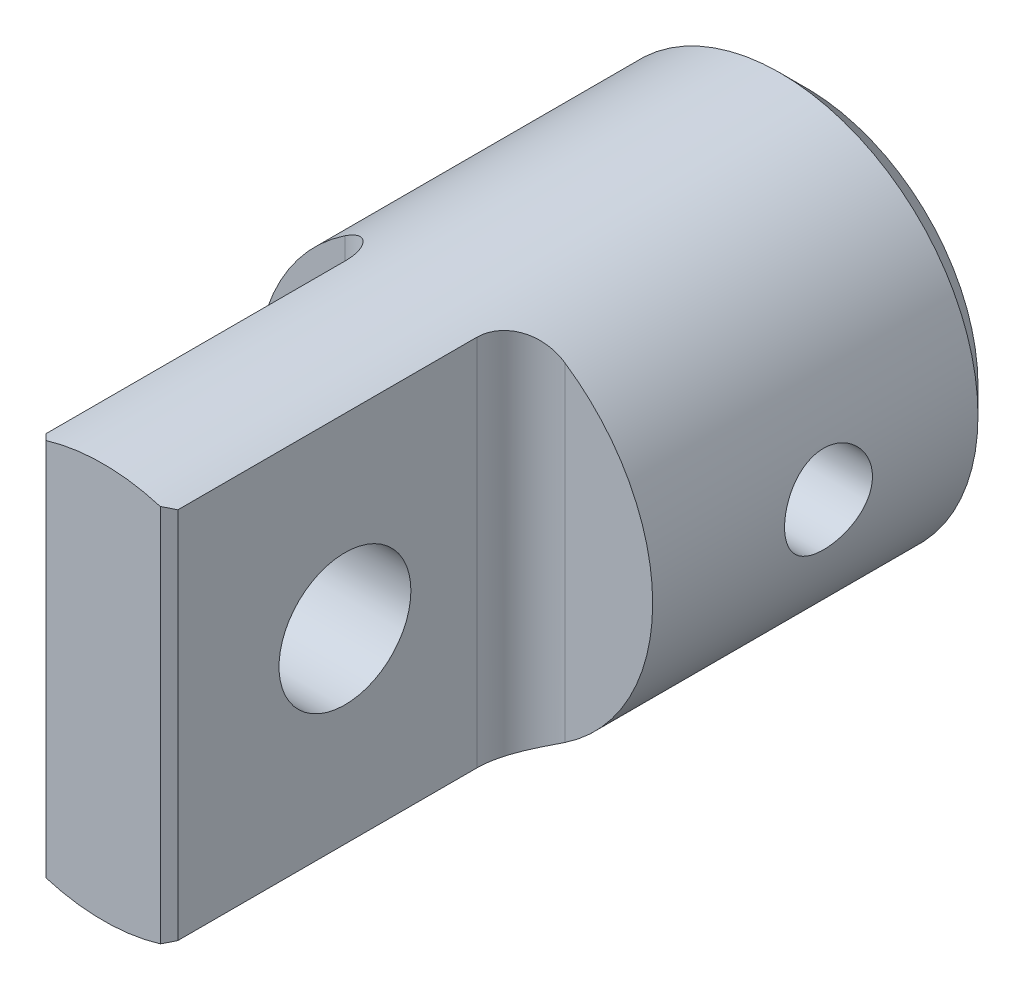
ISO-10303-21;
HEADER;
FILE_DESCRIPTION(('STEP AP214'),'2;1');
FILE_NAME('part.step','',(''),(''),'','','');
FILE_SCHEMA(('AUTOMOTIVE_DESIGN { 1 0 10303 214 1 1 1 1 }'));
ENDSEC;
DATA;
#1=APPLICATION_CONTEXT('core data for automotive mechanical design processes');
#2=APPLICATION_PROTOCOL_DEFINITION('international standard','automotive_design',2000,#1);
#3=PRODUCT_CONTEXT('',#1,'mechanical');
#4=PRODUCT('Part','Part','',(#3));
#5=PRODUCT_RELATED_PRODUCT_CATEGORY('part','',(#4));
#6=PRODUCT_DEFINITION_FORMATION('','',#4);
#7=PRODUCT_DEFINITION_CONTEXT('part definition',#1,'design');
#8=PRODUCT_DEFINITION('design','',#6,#7);
#9=PRODUCT_DEFINITION_SHAPE('','',#8);
#10=(LENGTH_UNIT() NAMED_UNIT(*) SI_UNIT(.MILLI.,.METRE.));
#11=(NAMED_UNIT(*) PLANE_ANGLE_UNIT() SI_UNIT($,.RADIAN.));
#12=(NAMED_UNIT(*) SI_UNIT($,.STERADIAN.) SOLID_ANGLE_UNIT());
#13=UNCERTAINTY_MEASURE_WITH_UNIT(LENGTH_MEASURE(1.E-05),#10,'distance_accuracy_value','');
#14=(GEOMETRIC_REPRESENTATION_CONTEXT(3) GLOBAL_UNCERTAINTY_ASSIGNED_CONTEXT((#13)) GLOBAL_UNIT_ASSIGNED_CONTEXT((#10,
#11,#12)) REPRESENTATION_CONTEXT('',''));
#15=CARTESIAN_POINT('',(0.,0.,0.));
#16=DIRECTION('',(0.,0.,1.));
#17=DIRECTION('',(1.,0.,0.));
#18=AXIS2_PLACEMENT_3D('',#15,#16,#17);
#19=CARTESIAN_POINT('',(0.,0.,80.));
#20=DIRECTION('',(0.,0.,-1.));
#21=DIRECTION('',(-1.,0.,0.));
#22=AXIS2_PLACEMENT_3D('',#19,#20,#21);
#23=CYLINDRICAL_SURFACE('',#22,22.5);
#24=CARTESIAN_POINT('',(-22.5,0.,15.));
#25=CARTESIAN_POINT('',(-22.4999949054563,0.277201191939118,15.0000093091996));
#26=CARTESIAN_POINT('',(-22.4948253498923,0.554513913174048,15.0231299541587));
#27=CARTESIAN_POINT('',(-22.4747024439418,1.10125486025783,15.1149011808764));
#28=CARTESIAN_POINT('',(-22.4597422554339,1.37067743784747,15.1835835850232));
#29=CARTESIAN_POINT('',(-22.421702829225,1.89365819440382,15.3642149262291));
#30=CARTESIAN_POINT('',(-22.3986322109764,2.14723288025071,15.4761179424947));
#31=CARTESIAN_POINT('',(-22.3468583860351,2.6320004507844,15.739866531181));
#32=CARTESIAN_POINT('',(-22.3181552886865,2.86319376983337,15.8917113282266));
#33=CARTESIAN_POINT('',(-22.2577273543527,3.30046578503508,16.2336891627666));
#34=CARTESIAN_POINT('',(-22.2259640410261,3.5061215301088,16.4243562553376));
#35=CARTESIAN_POINT('',(-22.1632650270043,3.88281227614595,16.8374201502331));
#36=CARTESIAN_POINT('',(-22.132329402237,4.05384411027149,17.059819851777));
#37=CARTESIAN_POINT('',(-22.0744082065066,4.35831108525865,17.5331796101448));
#38=CARTESIAN_POINT('',(-22.0474718934386,4.49129355260966,17.7844373951004));
#39=CARTESIAN_POINT('',(-22.0011524089458,4.71298247386312,18.3064319042344));
#40=CARTESIAN_POINT('',(-21.9817683031266,4.80169440550397,18.5771662137733));
#41=CARTESIAN_POINT('',(-21.9531402359799,4.93092145016118,19.1258336933053));
#42=CARTESIAN_POINT('',(-21.9437386433446,4.97218667594937,19.4035817877401));
#43=CARTESIAN_POINT('',(-21.9356668414217,5.00768177493915,19.9622055444361));
#44=CARTESIAN_POINT('',(-21.9369952689832,5.00191762279195,20.2430808048922));
#45=CARTESIAN_POINT('',(-21.9500908041844,4.94412068793336,20.794391567986));
#46=CARTESIAN_POINT('',(-21.9616607847499,4.89296161150564,21.0649240603488));
#47=CARTESIAN_POINT('',(-21.993623854663,4.74721226702843,21.5934678583121));
#48=CARTESIAN_POINT('',(-22.0140174532947,4.65261949204123,21.8514784402134));
#49=CARTESIAN_POINT('',(-22.0615227492924,4.42189182182192,22.3500985959548));
#50=CARTESIAN_POINT('',(-22.0886881090716,4.28542298448383,22.5905483183402));
#51=CARTESIAN_POINT('',(-22.1466434477592,3.97505170349622,23.0454571762897));
#52=CARTESIAN_POINT('',(-22.1774339355124,3.80114400185685,23.2599126545504));
#53=CARTESIAN_POINT('',(-22.2400143653192,3.41621709257457,23.6617732733712));
#54=CARTESIAN_POINT('',(-22.2718112671975,3.20445551316558,23.8484669627626));
#55=CARTESIAN_POINT('',(-22.3321959780572,2.75226654522904,24.1838093222678));
#56=CARTESIAN_POINT('',(-22.3607837252105,2.51183860459342,24.3324572594547));
#57=CARTESIAN_POINT('',(-22.4116266058404,2.00825797683683,24.587673189442));
#58=CARTESIAN_POINT('',(-22.4338673251915,1.74505530579963,24.6941456107706));
#59=CARTESIAN_POINT('',(-22.4694034091563,1.20388982745364,24.8611525326447));
#60=CARTESIAN_POINT('',(-22.4827001174196,0.925929243983408,24.9216939335353));
#61=CARTESIAN_POINT('',(-22.4986579440418,0.369238708202107,24.9940800331379));
#62=CARTESIAN_POINT('',(-22.5015312155572,0.0906409932972585,25.0068962504042));
#63=CARTESIAN_POINT('',(-22.496913966265,-0.464714809820204,24.9861047393491));
#64=CARTESIAN_POINT('',(-22.4894241722617,-0.74147302567662,24.9525002667014));
#65=CARTESIAN_POINT('',(-22.4650564689652,-1.28205814332355,24.8406264620798));
#66=CARTESIAN_POINT('',(-22.4482861751934,-1.5459962292887,24.7628688594414));
#67=CARTESIAN_POINT('',(-22.4072355271705,-2.05708201463959,24.5654657813873));
#68=CARTESIAN_POINT('',(-22.3829545191188,-2.30422825002548,24.4458166592349));
#69=CARTESIAN_POINT('',(-22.3290538306887,-2.77871609973592,24.1660178080026));
#70=CARTESIAN_POINT('',(-22.2993611147475,-3.00571432708049,24.005300142485));
#71=CARTESIAN_POINT('',(-22.2380758087357,-3.42986741247043,23.648671877246));
#72=CARTESIAN_POINT('',(-22.2064829637869,-3.6270182543358,23.4527565491682));
#73=CARTESIAN_POINT('',(-22.1442219736121,-3.98973870477415,23.0268299160498));
#74=CARTESIAN_POINT('',(-22.1135829414823,-4.1546345485,22.7962397749894));
#75=CARTESIAN_POINT('',(-22.0573848845825,-4.44336529807064,22.3100699139671));
#76=CARTESIAN_POINT('',(-22.0318256378478,-4.56720199818121,22.0544912866227));
#77=CARTESIAN_POINT('',(-21.9889300132591,-4.76945004740288,21.5269792772506));
#78=CARTESIAN_POINT('',(-21.9715469897688,-4.84811965884861,21.255148894392));
#79=CARTESIAN_POINT('',(-21.9468912408989,-4.95855069144011,20.7016895379162));
#80=CARTESIAN_POINT('',(-21.9396168385988,-4.99031989295584,20.4200621974652));
#81=CARTESIAN_POINT('',(-21.936110036307,-5.00570891602905,19.8618028042766));
#82=CARTESIAN_POINT('',(-21.9396324581123,-4.99039782859127,19.5852012298064));
#83=CARTESIAN_POINT('',(-21.956766622574,-4.91445692803306,19.0386257250505));
#84=CARTESIAN_POINT('',(-21.9703782383105,-4.85382768500485,18.7686517114357));
#85=CARTESIAN_POINT('',(-22.0060357036517,-4.68949549952189,18.243877199444));
#86=CARTESIAN_POINT('',(-22.0280501296667,-4.58595291571222,17.9890242077993));
#87=CARTESIAN_POINT('',(-22.078044111629,-4.33886925870767,17.5001500186298));
#88=CARTESIAN_POINT('',(-22.1060243118894,-4.1953238646296,17.2661310750891));
#89=CARTESIAN_POINT('',(-22.1655260709102,-3.86878397476419,16.820308477631));
#90=CARTESIAN_POINT('',(-22.1971092842007,-3.68502963777602,16.6090694876936));
#91=CARTESIAN_POINT('',(-22.2598493543275,-3.28482176486253,16.2200748151714));
#92=CARTESIAN_POINT('',(-22.2910061107244,-3.06836066558357,16.0423268987289));
#93=CARTESIAN_POINT('',(-22.3498814931665,-2.60536492661394,15.7230600427003));
#94=CARTESIAN_POINT('',(-22.3775480874812,-2.35846409158738,15.5820620006627));
#95=CARTESIAN_POINT('',(-22.4258014592307,-1.84390069944704,15.343791739547));
#96=CARTESIAN_POINT('',(-22.4463940817703,-1.57625550828249,15.2464833998846));
#97=CARTESIAN_POINT('',(-22.474570322739,-1.09034561932353,15.115396624308));
#98=CARTESIAN_POINT('',(-22.4840467255803,-0.874679979754207,15.0722065658343));
#99=CARTESIAN_POINT('',(-22.4967634364947,-0.439366124736322,15.0145052392346));
#100=CARTESIAN_POINT('',(-22.5000040380903,-0.219718097232198,14.9999926212452));
#101=CARTESIAN_POINT('',(-22.5,0.,15.));
#102=B_SPLINE_CURVE_WITH_KNOTS('',3,(#24,#25,#26,#27,#28,#29,#30,#31,#32,#33,#34,#35,#36,#37,
#38,#39,#40,#41,#42,#43,#44,#45,#46,#47,#48,#49,#50,#51,#52,#53,#54,#55,#56,#57,#58,#59,#60,#61,
#62,#63,#64,#65,#66,#67,#68,#69,#70,#71,#72,#73,#74,#75,#76,#77,#78,#79,#80,#81,#82,#83,#84,#85,
#86,#87,#88,#89,#90,#91,#92,#93,#94,#95,#96,#97,#98,#99,#100,#101),.UNSPECIFIED.,.T.,.F.,(4,2,2,
2,2,2,2,2,2,2,2,2,2,2,2,2,2,2,2,2,2,2,2,2,2,2,2,2,2,2,2,2,2,2,2,2,2,2,4),(0.,0.830799224324492,
1.66217932812321,2.49267853101864,3.32316161292473,4.16595180005197,5.00881903726285,
5.86133240744939,6.7137402671935,7.55247814098694,8.39110946248412,9.21394170371394,
10.0368214437428,10.8664417428089,11.6961786315268,12.5444544952938,13.392746699315,
14.2429503203503,15.093026187619,15.9256998031761,16.758315022876,17.5814717356985,
18.4047001237058,19.2399950816204,20.0754023347633,20.9267368277125,21.7780341128296,
22.6244139764775,23.4706534172859,24.2978196287089,25.1249754347416,25.9490678005646,
26.7732492148298,27.6146081579908,28.4561619618304,29.3090646764094,30.1612609469435,
30.8198086841341,31.4783254223689),.UNSPECIFIED.);
#103=CARTESIAN_POINT('',(-22.5,0.,15.));
#104=VERTEX_POINT('',#103);
#105=EDGE_CURVE('E11',#104,#104,#102,.T.);
#106=ORIENTED_EDGE('',*,*,#105,.T.);
#107=EDGE_LOOP('',(#106));
#108=FACE_BOUND('',#107,.T.);
#109=CARTESIAN_POINT('',(22.5,0.,15.));
#110=CARTESIAN_POINT('',(22.4999949054563,-0.277201191939121,15.0000093091996));
#111=CARTESIAN_POINT('',(22.4948253498922,-0.554513913174051,15.0231299541587));
#112=CARTESIAN_POINT('',(22.4747024439418,-1.10125486025784,15.1149011808764));
#113=CARTESIAN_POINT('',(22.4597422554339,-1.37067743784747,15.1835835850232));
#114=CARTESIAN_POINT('',(22.421702829225,-1.89365819440382,15.3642149262291));
#115=CARTESIAN_POINT('',(22.3986322109764,-2.14723288025071,15.4761179424947));
#116=CARTESIAN_POINT('',(22.3468583860351,-2.63200045078441,15.739866531181));
#117=CARTESIAN_POINT('',(22.3181552886865,-2.86319376983337,15.8917113282266));
#118=CARTESIAN_POINT('',(22.2577273543527,-3.30046578503508,16.2336891627666));
#119=CARTESIAN_POINT('',(22.2259640410261,-3.50612153010881,16.4243562553376));
#120=CARTESIAN_POINT('',(22.1632650270043,-3.88281227614596,16.8374201502331));
#121=CARTESIAN_POINT('',(22.132329402237,-4.05384411027149,17.059819851777));
#122=CARTESIAN_POINT('',(22.0744082065066,-4.35831108525865,17.5331796101448));
#123=CARTESIAN_POINT('',(22.0474718934386,-4.49129355260967,17.7844373951004));
#124=CARTESIAN_POINT('',(22.0011524089458,-4.71298247386313,18.3064319042345));
#125=CARTESIAN_POINT('',(21.9817683031266,-4.80169440550397,18.5771662137733));
#126=CARTESIAN_POINT('',(21.9531402359799,-4.93092145016118,19.1258336933053));
#127=CARTESIAN_POINT('',(21.9437386433446,-4.97218667594937,19.4035817877401));
#128=CARTESIAN_POINT('',(21.9356668414217,-5.00768177493916,19.9622055444361));
#129=CARTESIAN_POINT('',(21.9369952689832,-5.00191762279196,20.2430808048922));
#130=CARTESIAN_POINT('',(21.9500908041844,-4.94412068793337,20.794391567986));
#131=CARTESIAN_POINT('',(21.9616607847499,-4.89296161150565,21.0649240603488));
#132=CARTESIAN_POINT('',(21.993623854663,-4.74721226702843,21.5934678583121));
#133=CARTESIAN_POINT('',(22.0140174532947,-4.65261949204123,21.8514784402134));
#134=CARTESIAN_POINT('',(22.0615227492924,-4.42189182182193,22.3500985959548));
#135=CARTESIAN_POINT('',(22.0886881090716,-4.28542298448384,22.5905483183402));
#136=CARTESIAN_POINT('',(22.1466434477592,-3.97505170349623,23.0454571762897));
#137=CARTESIAN_POINT('',(22.1774339355124,-3.80114400185685,23.2599126545504));
#138=CARTESIAN_POINT('',(22.2400143653192,-3.41621709257458,23.6617732733712));
#139=CARTESIAN_POINT('',(22.2718112671975,-3.20445551316559,23.8484669627626));
#140=CARTESIAN_POINT('',(22.3321959780572,-2.75226654522905,24.1838093222678));
#141=CARTESIAN_POINT('',(22.3607837252105,-2.51183860459343,24.3324572594547));
#142=CARTESIAN_POINT('',(22.4116266058404,-2.00825797683684,24.587673189442));
#143=CARTESIAN_POINT('',(22.4338673251915,-1.74505530579964,24.6941456107706));
#144=CARTESIAN_POINT('',(22.4694034091563,-1.20388982745364,24.8611525326447));
#145=CARTESIAN_POINT('',(22.4827001174196,-0.925929243983415,24.9216939335353));
#146=CARTESIAN_POINT('',(22.4986579440418,-0.369238708202114,24.9940800331379));
#147=CARTESIAN_POINT('',(22.5015312155572,-0.0906409932972653,25.0068962504042));
#148=CARTESIAN_POINT('',(22.496913966265,0.464714809820198,24.9861047393491));
#149=CARTESIAN_POINT('',(22.4894241722617,0.741473025676614,24.9525002667014));
#150=CARTESIAN_POINT('',(22.4650564689652,1.28205814332355,24.8406264620798));
#151=CARTESIAN_POINT('',(22.4482861751934,1.5459962292887,24.7628688594414));
#152=CARTESIAN_POINT('',(22.4072355271705,2.05708201463959,24.5654657813873));
#153=CARTESIAN_POINT('',(22.3829545191188,2.30422825002548,24.4458166592349));
#154=CARTESIAN_POINT('',(22.3290538306887,2.77871609973591,24.1660178080026));
#155=CARTESIAN_POINT('',(22.2993611147475,3.00571432708048,24.005300142485));
#156=CARTESIAN_POINT('',(22.2380758087357,3.42986741247042,23.648671877246));
#157=CARTESIAN_POINT('',(22.2064829637869,3.62701825433579,23.4527565491682));
#158=CARTESIAN_POINT('',(22.1442219736121,3.98973870477415,23.0268299160498));
#159=CARTESIAN_POINT('',(22.1135829414823,4.15463454849999,22.7962397749894));
#160=CARTESIAN_POINT('',(22.0573848845825,4.44336529807064,22.3100699139671));
#161=CARTESIAN_POINT('',(22.0318256378478,4.5672019981812,22.0544912866227));
#162=CARTESIAN_POINT('',(21.9889300132591,4.76945004740287,21.5269792772506));
#163=CARTESIAN_POINT('',(21.9715469897688,4.8481196588486,21.255148894392));
#164=CARTESIAN_POINT('',(21.9468912408989,4.9585506914401,20.7016895379162));
#165=CARTESIAN_POINT('',(21.9396168385988,4.99031989295583,20.4200621974652));
#166=CARTESIAN_POINT('',(21.936110036307,5.00570891602905,19.8618028042766));
#167=CARTESIAN_POINT('',(21.9396324581123,4.99039782859127,19.5852012298064));
#168=CARTESIAN_POINT('',(21.956766622574,4.91445692803305,19.0386257250505));
#169=CARTESIAN_POINT('',(21.9703782383105,4.85382768500485,18.7686517114357));
#170=CARTESIAN_POINT('',(22.0060357036517,4.68949549952189,18.243877199444));
#171=CARTESIAN_POINT('',(22.0280501296667,4.58595291571221,17.9890242077993));
#172=CARTESIAN_POINT('',(22.078044111629,4.33886925870767,17.5001500186298));
#173=CARTESIAN_POINT('',(22.1060243118894,4.1953238646296,17.2661310750891));
#174=CARTESIAN_POINT('',(22.1655260709102,3.86878397476419,16.820308477631));
#175=CARTESIAN_POINT('',(22.1971092842007,3.68502963777602,16.6090694876936));
#176=CARTESIAN_POINT('',(22.2598493543275,3.28482176486253,16.2200748151714));
#177=CARTESIAN_POINT('',(22.2910061107244,3.06836066558357,16.0423268987289));
#178=CARTESIAN_POINT('',(22.3498814931665,2.60536492661393,15.7230600427003));
#179=CARTESIAN_POINT('',(22.3775480874812,2.35846409158737,15.5820620006627));
#180=CARTESIAN_POINT('',(22.4258014592307,1.84390069944704,15.343791739547));
#181=CARTESIAN_POINT('',(22.4463940817703,1.57625550828248,15.2464833998846));
#182=CARTESIAN_POINT('',(22.474570322739,1.09034561932352,15.115396624308));
#183=CARTESIAN_POINT('',(22.4840467255803,0.874679979754204,15.0722065658343));
#184=CARTESIAN_POINT('',(22.4967634364947,0.439366124736319,15.0145052392346));
#185=CARTESIAN_POINT('',(22.5000040380903,0.219718097232195,14.9999926212452));
#186=CARTESIAN_POINT('',(22.5,0.,15.));
#187=B_SPLINE_CURVE_WITH_KNOTS('',3,(#109,#110,#111,#112,#113,#114,#115,#116,#117,#118,#119,
#120,#121,#122,#123,#124,#125,#126,#127,#128,#129,#130,#131,#132,#133,#134,#135,#136,#137,#138,
#139,#140,#141,#142,#143,#144,#145,#146,#147,#148,#149,#150,#151,#152,#153,#154,#155,#156,#157,
#158,#159,#160,#161,#162,#163,#164,#165,#166,#167,#168,#169,#170,#171,#172,#173,#174,#175,#176,
#177,#178,#179,#180,#181,#182,#183,#184,#185,#186),.UNSPECIFIED.,.T.,.F.,(4,2,2,2,2,2,2,2,2,2,2,
2,2,2,2,2,2,2,2,2,2,2,2,2,2,2,2,2,2,2,2,2,2,2,2,2,2,2,4),(0.,0.830799224324492,1.66217932812321,
2.49267853101865,3.32316161292473,4.16595180005198,5.00881903726285,5.8613324074494,
6.7137402671935,7.55247814098695,8.39110946248412,9.21394170371394,10.0368214437428,
10.8664417428089,11.6961786315269,12.5444544952938,13.392746699315,14.2429503203503,
15.093026187619,15.9256998031761,16.758315022876,17.5814717356985,18.4047001237058,
19.2399950816204,20.0754023347633,20.9267368277126,21.7780341128296,22.6244139764775,
23.4706534172859,24.2978196287089,25.1249754347416,25.9490678005646,26.7732492148298,
27.6146081579908,28.4561619618304,29.3090646764094,30.1612609469435,30.8198086841341,
31.4783254223689),.UNSPECIFIED.);
#188=CARTESIAN_POINT('',(22.5,0.,15.));
#189=VERTEX_POINT('',#188);
#190=EDGE_CURVE('E47',#189,#189,#187,.T.);
#191=ORIENTED_EDGE('',*,*,#190,.T.);
#192=EDGE_LOOP('',(#191));
#193=FACE_BOUND('',#192,.T.);
#194=CARTESIAN_POINT('',(0.,0.,3.00000000000002));
#195=DIRECTION('',(0.,0.,1.));
#196=DIRECTION('',(1.,0.,0.));
#197=AXIS2_PLACEMENT_3D('',#194,#195,#196);
#198=CIRCLE('',#197,22.5);
#199=CARTESIAN_POINT('',(22.5,0.,3.00000000000002));
#200=VERTEX_POINT('',#199);
#201=EDGE_CURVE('E201',#200,#200,#198,.T.);
#202=ORIENTED_EDGE('',*,*,#201,.T.);
#203=EDGE_LOOP('',(#202));
#204=FACE_BOUND('',#203,.T.);
#205=DIRECTION('',(0.,0.,1.));
#206=VECTOR('',#205,1.);
#207=CARTESIAN_POINT('',(-7.49999999999999,21.2132034355964,40.));
#208=LINE('',#207,#206);
#209=CARTESIAN_POINT('',(-7.49999999999999,21.2132034355964,45.));
#210=VERTEX_POINT('',#209);
#211=CARTESIAN_POINT('',(-7.49999999999999,21.2132034355964,79.));
#212=VERTEX_POINT('',#211);
#213=EDGE_CURVE('E130',#210,#212,#208,.T.);
#214=ORIENTED_EDGE('',*,*,#213,.T.);
#215=CARTESIAN_POINT('',(0.,0.,86.5));
#216=DIRECTION('',(-0.707106781186547,0.,0.707106781186547));
#217=DIRECTION('',(-0.707106781186548,0.,-0.707106781186548));
#218=AXIS2_PLACEMENT_3D('',#215,#216,#217);
#219=ELLIPSE('',#218,31.8198051533946,22.5);
#220=CARTESIAN_POINT('',(-6.49999999999998,21.540659228538,80.));
#221=VERTEX_POINT('',#220);
#222=EDGE_CURVE('E193',#212,#221,#219,.F.);
#223=ORIENTED_EDGE('',*,*,#222,.T.);
#224=CARTESIAN_POINT('',(0.,0.,80.));
#225=DIRECTION('',(0.,0.,1.));
#226=DIRECTION('',(1.,0.,0.));
#227=AXIS2_PLACEMENT_3D('',#224,#225,#226);
#228=CIRCLE('',#227,22.5);
#229=CARTESIAN_POINT('',(6.5,21.540659228538,80.));
#230=VERTEX_POINT('',#229);
#231=EDGE_CURVE('E123',#230,#221,#228,.T.);
#232=ORIENTED_EDGE('',*,*,#231,.F.);
#233=CARTESIAN_POINT('',(0.,0.,86.5));
#234=DIRECTION('',(0.707106781186547,0.,0.707106781186547));
#235=DIRECTION('',(0.707106781186548,0.,-0.707106781186548));
#236=AXIS2_PLACEMENT_3D('',#233,#234,#235);
#237=ELLIPSE('',#236,31.8198051533946,22.5);
#238=CARTESIAN_POINT('',(7.5,21.2132034355964,79.));
#239=VERTEX_POINT('',#238);
#240=EDGE_CURVE('E62',#230,#239,#237,.F.);
#241=ORIENTED_EDGE('',*,*,#240,.T.);
#242=DIRECTION('',(0.,0.,1.));
#243=VECTOR('',#242,1.);
#244=CARTESIAN_POINT('',(7.5,21.2132034355964,40.));
#245=LINE('',#244,#243);
#246=CARTESIAN_POINT('',(7.5,21.2132034355964,45.));
#247=VERTEX_POINT('',#246);
#248=EDGE_CURVE('E141',#247,#239,#245,.T.);
#249=ORIENTED_EDGE('',*,*,#248,.F.);
#250=CARTESIAN_POINT('',(7.5,21.2132034355964,45.));
#251=CARTESIAN_POINT('',(7.49998150903949,21.2132003490023,44.8664270397712));
#252=CARTESIAN_POINT('',(7.50535172515584,21.211311018415,44.7328571393281));
#253=CARTESIAN_POINT('',(7.52673582065039,21.2037375380559,44.4666921659006));
#254=CARTESIAN_POINT('',(7.54274872950972,21.1980537343062,44.3340970051434));
#255=CARTESIAN_POINT('',(7.58525010226474,21.1828812653609,44.0710384432615));
#256=CARTESIAN_POINT('',(7.61172157923189,21.1733987696983,43.940571940792));
#257=CARTESIAN_POINT('',(7.67487944881038,21.1505876802719,43.6824803501461));
#258=CARTESIAN_POINT('',(7.71156578091309,21.1372591092908,43.5548552451434));
#259=CARTESIAN_POINT('',(7.79480422035357,21.1067048309349,43.3033316720219));
#260=CARTESIAN_POINT('',(7.84135723303362,21.0894787659259,43.1794335470738));
#261=CARTESIAN_POINT('',(7.94389448722506,21.051069737027,42.9361856601587));
#262=CARTESIAN_POINT('',(7.99988219424342,21.0298853188614,42.8168375893206));
#263=CARTESIAN_POINT('',(8.12071268332484,20.9835223124631,42.5835793128507));
#264=CARTESIAN_POINT('',(8.18555229659528,20.9583451530272,42.4696671808739));
#265=CARTESIAN_POINT('',(8.32350149628991,20.9039426829782,42.2479249864667));
#266=CARTESIAN_POINT('',(8.39661415138138,20.8747158693439,42.1400972032375));
#267=CARTESIAN_POINT('',(8.5512533709621,20.811850159116,41.9300491161963));
#268=CARTESIAN_POINT('',(8.63286506063967,20.7781654797708,41.8279052138997));
#269=CARTESIAN_POINT('',(8.80305539397431,20.7066350850317,41.6310932852656));
#270=CARTESIAN_POINT('',(8.89163656836429,20.6687878561454,41.5364279997742));
#271=CARTESIAN_POINT('',(9.07485876899442,20.5889998367405,41.3551395312159));
#272=CARTESIAN_POINT('',(9.16949647803641,20.547061280575,41.2685120084508));
#273=CARTESIAN_POINT('',(9.36405144093677,20.4591285148317,41.1035788752186));
#274=CARTESIAN_POINT('',(9.46397058374076,20.41313285021,41.0252762727913));
#275=CARTESIAN_POINT('',(9.67290085000644,20.3149923012384,40.8738745684245));
#276=CARTESIAN_POINT('',(9.78211876910369,20.2626617617646,40.801181279701));
#277=CARTESIAN_POINT('',(10.0044227821049,20.1538295931971,40.6653639095144));
#278=CARTESIAN_POINT('',(10.1175105015723,20.0973261994031,40.6022439114538));
#279=CARTESIAN_POINT('',(10.3467112757889,19.9802938280758,40.4855893519752));
#280=CARTESIAN_POINT('',(10.4628278317176,19.9197600536975,40.432066502924));
#281=CARTESIAN_POINT('',(10.6970751809104,19.7949539009241,40.3346429065829));
#282=CARTESIAN_POINT('',(10.8152061809303,19.730681137119,40.29074315346));
#283=CARTESIAN_POINT('',(11.0642251782724,19.5922213088778,40.2086147901549));
#284=CARTESIAN_POINT('',(11.1952349504553,19.5176783512189,40.1713551214367));
#285=CARTESIAN_POINT('',(11.4577326298156,19.3647477538406,40.107974180272));
#286=CARTESIAN_POINT('',(11.5892206468461,19.2863591713673,40.0818556544415));
#287=CARTESIAN_POINT('',(11.851350374371,19.1263943184109,40.0404836182477));
#288=CARTESIAN_POINT('',(11.9819934463727,19.0448292888366,40.0251949193589));
#289=CARTESIAN_POINT('',(12.2420648965847,18.8787121760226,40.0049548032461));
#290=CARTESIAN_POINT('',(12.3714939940709,18.7941620242899,39.999996821874));
#291=CARTESIAN_POINT('',(12.5,18.7082869338697,40.));
#292=B_SPLINE_CURVE_WITH_KNOTS('',3,(#250,#251,#252,#253,#254,#255,#256,#257,#258,#259,#260,
#261,#262,#263,#264,#265,#266,#267,#268,#269,#270,#271,#272,#273,#274,#275,#276,#277,#278,#279,
#280,#281,#282,#283,#284,#285,#286,#287,#288,#289,#290,#291),.UNSPECIFIED.,.F.,.F.,(4,2,2,2,2,2,
2,2,2,2,2,2,2,2,2,2,2,2,2,2,4),(0.,0.400593133331195,0.801149741145093,1.20105841730863,
1.60096472462688,2.00090774226043,2.40099798655656,2.80094538085743,3.20104161445101,
3.60562250752044,4.01035099456462,4.41485967587405,4.81951402490366,5.24280737780397,
5.66628077801757,6.09026751922222,6.51429804210298,6.97963228970663,7.4450811895378,
7.90901071731774,8.37264537381502),.UNSPECIFIED.);
#293=CARTESIAN_POINT('',(12.5,18.7082869338697,40.));
#294=VERTEX_POINT('',#293);
#295=EDGE_CURVE('E181',#247,#294,#292,.T.);
#296=ORIENTED_EDGE('',*,*,#295,.T.);
#297=CARTESIAN_POINT('',(0.,0.,40.));
#298=DIRECTION('',(0.,0.,1.));
#299=DIRECTION('',(1.,0.,0.));
#300=AXIS2_PLACEMENT_3D('',#297,#298,#299);
#301=CIRCLE('',#300,22.5);
#302=CARTESIAN_POINT('',(12.5,-18.7082869338697,40.));
#303=VERTEX_POINT('',#302);
#304=EDGE_CURVE('E137',#303,#294,#301,.T.);
#305=ORIENTED_EDGE('',*,*,#304,.F.);
#306=CARTESIAN_POINT('',(12.5,-18.7082869338697,40.));
#307=CARTESIAN_POINT('',(12.3561177487719,-18.8044436231383,39.9999944746867));
#308=CARTESIAN_POINT('',(12.211066271406,-18.8989383441527,40.0062118700061));
#309=CARTESIAN_POINT('',(11.9195351640064,-19.0841378088686,40.0316525076896));
#310=CARTESIAN_POINT('',(11.7730544848007,-19.1748394618158,40.0508861451327));
#311=CARTESIAN_POINT('',(11.4788867543971,-19.3523876690203,40.1030846342394));
#312=CARTESIAN_POINT('',(11.3311979089039,-19.4392063986803,40.1361350605206));
#313=CARTESIAN_POINT('',(11.036848726242,-19.6078228063385,40.2164392988841));
#314=CARTESIAN_POINT('',(10.890188150846,-19.6896216838263,40.2636897018549));
#315=CARTESIAN_POINT('',(10.5985122685481,-19.8481546209287,40.3730429228935));
#316=CARTESIAN_POINT('',(10.4535103891629,-19.9248584557491,40.4352257448409));
#317=CARTESIAN_POINT('',(10.1676435817552,-20.0722415505145,40.5744623886905));
#318=CARTESIAN_POINT('',(10.0267781804347,-20.1429215014899,40.6515145015414));
#319=CARTESIAN_POINT('',(9.75135949453412,-20.2776830248994,40.8201706539726));
#320=CARTESIAN_POINT('',(9.61678898983859,-20.3417832504706,40.9117315727977));
#321=CARTESIAN_POINT('',(9.35539735398862,-20.4633162511666,41.1092044137199));
#322=CARTESIAN_POINT('',(9.22857478249998,-20.5207502673313,41.2151136566248));
#323=CARTESIAN_POINT('',(9.00033179079538,-20.6217734517753,41.426030968812));
#324=CARTESIAN_POINT('',(8.89774698166526,-20.6661925723657,41.5293855358645));
#325=CARTESIAN_POINT('',(8.70107472153944,-20.7497641914873,41.7458423623547));
#326=CARTESIAN_POINT('',(8.60698622819787,-20.7889173363487,41.8589434227359));
#327=CARTESIAN_POINT('',(8.42839830298474,-20.8619610935902,42.0941647771049));
#328=CARTESIAN_POINT('',(8.34390380361013,-20.8958490022575,42.216289657667));
#329=CARTESIAN_POINT('',(8.18561273454077,-20.9583632471443,42.4685518382604));
#330=CARTESIAN_POINT('',(8.1118152119535,-20.9869900520867,42.5986884231316));
#331=CARTESIAN_POINT('',(7.98197349936542,-21.0366938375348,42.853830735668));
#332=CARTESIAN_POINT('',(7.92492860134811,-21.0582187836017,42.978241390412));
#333=CARTESIAN_POINT('',(7.82105108638972,-21.0970196059392,43.2318894745384));
#334=CARTESIAN_POINT('',(7.77421764241857,-21.1142958263305,43.3611265120362));
#335=CARTESIAN_POINT('',(7.69130474271833,-21.1446395288063,43.6232911823413));
#336=CARTESIAN_POINT('',(7.65521092792667,-21.1577126324293,43.7562136252284));
#337=CARTESIAN_POINT('',(7.59407819434071,-21.1797315661948,44.0248592955523));
#338=CARTESIAN_POINT('',(7.56903459815011,-21.188679142685,44.1605813124563));
#339=CARTESIAN_POINT('',(7.53312000205429,-21.2014722040731,44.4135589589793));
#340=CARTESIAN_POINT('',(7.52069823403521,-21.2058774564818,44.5305690316368));
#341=CARTESIAN_POINT('',(7.50414021076698,-21.2117395194824,44.7650504596792));
#342=CARTESIAN_POINT('',(7.49999014354108,-21.2132012451786,44.8825207173782));
#343=CARTESIAN_POINT('',(7.5,-21.2132034355964,45.));
#344=B_SPLINE_CURVE_WITH_KNOTS('',3,(#306,#307,#308,#309,#310,#311,#312,#313,#314,#315,#316,
#317,#318,#319,#320,#321,#322,#323,#324,#325,#326,#327,#328,#329,#330,#331,#332,#333,#334,#335,
#336,#337,#338,#339,#340,#341,#342,#343),.UNSPECIFIED.,.F.,.F.,(4,2,2,2,2,2,2,2,2,2,2,2,2,2,2,2,
2,2,4),(0.,0.519115891451699,1.03864685115067,1.56144436041514,2.084116457284,2.60965394922212,
3.1351310726974,3.65907477842167,4.18292078520164,4.63904573958849,5.09511465936695,
5.55141700321473,6.00767867438823,6.42280843691377,6.83790456540181,7.2524431835658,
7.66680616485739,8.01973427991142,8.37207258489495),.UNSPECIFIED.);
#345=CARTESIAN_POINT('',(7.5,-21.2132034355964,45.));
#346=VERTEX_POINT('',#345);
#347=EDGE_CURVE('E176',#303,#346,#344,.T.);
#348=ORIENTED_EDGE('',*,*,#347,.T.);
#349=DIRECTION('',(0.,0.,1.));
#350=VECTOR('',#349,1.);
#351=CARTESIAN_POINT('',(7.5,-21.2132034355964,40.));
#352=LINE('',#351,#350);
#353=CARTESIAN_POINT('',(7.5,-21.2132034355964,79.));
#354=VERTEX_POINT('',#353);
#355=EDGE_CURVE('E142',#346,#354,#352,.T.);
#356=ORIENTED_EDGE('',*,*,#355,.T.);
#357=CARTESIAN_POINT('',(0.,0.,86.5));
#358=DIRECTION('',(0.707106781186547,0.,0.707106781186547));
#359=DIRECTION('',(0.707106781186548,0.,-0.707106781186548));
#360=AXIS2_PLACEMENT_3D('',#357,#358,#359);
#361=ELLIPSE('',#360,31.8198051533946,22.5);
#362=CARTESIAN_POINT('',(6.49999999999999,-21.540659228538,80.));
#363=VERTEX_POINT('',#362);
#364=EDGE_CURVE('E54',#354,#363,#361,.F.);
#365=ORIENTED_EDGE('',*,*,#364,.T.);
#366=CARTESIAN_POINT('',(-6.49999999999998,-21.540659228538,80.));
#367=VERTEX_POINT('',#366);
#368=EDGE_CURVE('E145',#367,#363,#228,.T.);
#369=ORIENTED_EDGE('',*,*,#368,.F.);
#370=CARTESIAN_POINT('',(0.,0.,86.5));
#371=DIRECTION('',(-0.707106781186547,0.,0.707106781186547));
#372=DIRECTION('',(-0.707106781186548,0.,-0.707106781186548));
#373=AXIS2_PLACEMENT_3D('',#370,#371,#372);
#374=ELLIPSE('',#373,31.8198051533946,22.5);
#375=CARTESIAN_POINT('',(-7.49999999999999,-21.2132034355964,79.));
#376=VERTEX_POINT('',#375);
#377=EDGE_CURVE('E191',#367,#376,#374,.F.);
#378=ORIENTED_EDGE('',*,*,#377,.T.);
#379=DIRECTION('',(0.,0.,1.));
#380=VECTOR('',#379,1.);
#381=CARTESIAN_POINT('',(-7.49999999999999,-21.2132034355964,40.));
#382=LINE('',#381,#380);
#383=CARTESIAN_POINT('',(-7.49999999999999,-21.2132034355964,45.));
#384=VERTEX_POINT('',#383);
#385=EDGE_CURVE('E126',#384,#376,#382,.T.);
#386=ORIENTED_EDGE('',*,*,#385,.F.);
#387=CARTESIAN_POINT('',(-7.49999999999999,-21.2132034355964,45.));
#388=CARTESIAN_POINT('',(-7.49998150903948,-21.2132003490023,44.8664270397712));
#389=CARTESIAN_POINT('',(-7.50535172515583,-21.211311018415,44.7328571393281));
#390=CARTESIAN_POINT('',(-7.52673582065038,-21.2037375380559,44.4666921659006));
#391=CARTESIAN_POINT('',(-7.54274872950971,-21.1980537343062,44.3340970051434));
#392=CARTESIAN_POINT('',(-7.58525010226473,-21.1828812653609,44.0710384432615));
#393=CARTESIAN_POINT('',(-7.61172157923188,-21.1733987696983,43.940571940792));
#394=CARTESIAN_POINT('',(-7.67487944881037,-21.1505876802719,43.6824803501461));
#395=CARTESIAN_POINT('',(-7.71156578091308,-21.1372591092908,43.5548552451434));
#396=CARTESIAN_POINT('',(-7.79480422035356,-21.1067048309349,43.3033316720219));
#397=CARTESIAN_POINT('',(-7.84135723303361,-21.0894787659259,43.1794335470738));
#398=CARTESIAN_POINT('',(-7.94389448722505,-21.051069737027,42.9361856601587));
#399=CARTESIAN_POINT('',(-7.99988219424341,-21.0298853188614,42.8168375893206));
#400=CARTESIAN_POINT('',(-8.12071268332483,-20.9835223124631,42.5835793128507));
#401=CARTESIAN_POINT('',(-8.18555229659527,-20.9583451530272,42.4696671808739));
#402=CARTESIAN_POINT('',(-8.3235014962899,-20.9039426829782,42.2479249864668));
#403=CARTESIAN_POINT('',(-8.39661415138137,-20.874715869344,42.1400972032375));
#404=CARTESIAN_POINT('',(-8.55125337096209,-20.811850159116,41.9300491161963));
#405=CARTESIAN_POINT('',(-8.63286506063966,-20.7781654797708,41.8279052138998));
#406=CARTESIAN_POINT('',(-8.8030553939743,-20.7066350850317,41.6310932852656));
#407=CARTESIAN_POINT('',(-8.89163656836428,-20.6687878561454,41.5364279997742));
#408=CARTESIAN_POINT('',(-9.07485876899441,-20.5889998367405,41.3551395312159));
#409=CARTESIAN_POINT('',(-9.1694964780364,-20.547061280575,41.2685120084508));
#410=CARTESIAN_POINT('',(-9.36405144093676,-20.4591285148317,41.1035788752186));
#411=CARTESIAN_POINT('',(-9.46397058374075,-20.41313285021,41.0252762727913));
#412=CARTESIAN_POINT('',(-9.67290085000643,-20.3149923012384,40.8738745684245));
#413=CARTESIAN_POINT('',(-9.78211876910368,-20.2626617617646,40.8011812797009));
#414=CARTESIAN_POINT('',(-10.0044227821048,-20.1538295931971,40.6653639095144));
#415=CARTESIAN_POINT('',(-10.1175105015723,-20.0973261994031,40.6022439114538));
#416=CARTESIAN_POINT('',(-10.3467112757889,-19.9802938280758,40.4855893519752));
#417=CARTESIAN_POINT('',(-10.4628278317176,-19.9197600536975,40.432066502924));
#418=CARTESIAN_POINT('',(-10.6970751809104,-19.7949539009241,40.3346429065829));
#419=CARTESIAN_POINT('',(-10.8152061809303,-19.730681137119,40.29074315346));
#420=CARTESIAN_POINT('',(-11.0642251782724,-19.5922213088778,40.2086147901549));
#421=CARTESIAN_POINT('',(-11.1952349504552,-19.5176783512189,40.1713551214367));
#422=CARTESIAN_POINT('',(-11.4577326298156,-19.3647477538406,40.107974180272));
#423=CARTESIAN_POINT('',(-11.5892206468461,-19.2863591713673,40.0818556544415));
#424=CARTESIAN_POINT('',(-11.851350374371,-19.1263943184109,40.0404836182477));
#425=CARTESIAN_POINT('',(-11.9819934463727,-19.0448292888366,40.0251949193589));
#426=CARTESIAN_POINT('',(-12.2420648965847,-18.8787121760226,40.0049548032461));
#427=CARTESIAN_POINT('',(-12.3714939940709,-18.7941620242899,39.999996821874));
#428=CARTESIAN_POINT('',(-12.5,-18.7082869338697,40.));
#429=B_SPLINE_CURVE_WITH_KNOTS('',3,(#387,#388,#389,#390,#391,#392,#393,#394,#395,#396,#397,
#398,#399,#400,#401,#402,#403,#404,#405,#406,#407,#408,#409,#410,#411,#412,#413,#414,#415,#416,
#417,#418,#419,#420,#421,#422,#423,#424,#425,#426,#427,#428),.UNSPECIFIED.,.F.,.F.,(4,2,2,2,2,2,
2,2,2,2,2,2,2,2,2,2,2,2,2,2,4),(0.,0.400593133331188,0.801149741145093,1.20105841730863,
1.60096472462688,2.00090774226042,2.40099798655655,2.80094538085742,3.201041614451,
3.60562250752043,4.01035099456462,4.41485967587404,4.81951402490366,5.24280737780397,
5.66628077801757,6.09026751922222,6.51429804210298,6.97963228970663,7.4450811895378,
7.90901071731774,8.37264537381503),.UNSPECIFIED.);
#430=CARTESIAN_POINT('',(-12.5,-18.7082869338697,40.));
#431=VERTEX_POINT('',#430);
#432=EDGE_CURVE('E116',#384,#431,#429,.T.);
#433=ORIENTED_EDGE('',*,*,#432,.T.);
#434=CARTESIAN_POINT('',(0.,0.,40.));
#435=DIRECTION('',(0.,0.,1.));
#436=DIRECTION('',(1.,0.,0.));
#437=AXIS2_PLACEMENT_3D('',#434,#435,#436);
#438=CIRCLE('',#437,22.5);
#439=CARTESIAN_POINT('',(-12.5,18.7082869338697,40.));
#440=VERTEX_POINT('',#439);
#441=EDGE_CURVE('E122',#440,#431,#438,.T.);
#442=ORIENTED_EDGE('',*,*,#441,.F.);
#443=CARTESIAN_POINT('',(-12.5,18.7082869338697,40.));
#444=CARTESIAN_POINT('',(-12.3561177487719,18.8044436231383,39.9999944746867));
#445=CARTESIAN_POINT('',(-12.211066271406,18.8989383441527,40.0062118700061));
#446=CARTESIAN_POINT('',(-11.9195351640064,19.0841378088686,40.0316525076896));
#447=CARTESIAN_POINT('',(-11.7730544848007,19.1748394618158,40.0508861451327));
#448=CARTESIAN_POINT('',(-11.4788867543971,19.3523876690203,40.1030846342394));
#449=CARTESIAN_POINT('',(-11.3311979089039,19.4392063986803,40.1361350605206));
#450=CARTESIAN_POINT('',(-11.0368487262419,19.6078228063385,40.2164392988841));
#451=CARTESIAN_POINT('',(-10.890188150846,19.6896216838263,40.2636897018549));
#452=CARTESIAN_POINT('',(-10.5985122685481,19.8481546209287,40.3730429228935));
#453=CARTESIAN_POINT('',(-10.4535103891628,19.9248584557491,40.4352257448409));
#454=CARTESIAN_POINT('',(-10.1676435817551,20.0722415505145,40.5744623886905));
#455=CARTESIAN_POINT('',(-10.0267781804347,20.1429215014899,40.6515145015414));
#456=CARTESIAN_POINT('',(-9.75135949453411,20.2776830248994,40.8201706539726));
#457=CARTESIAN_POINT('',(-9.61678898983858,20.3417832504706,40.9117315727977));
#458=CARTESIAN_POINT('',(-9.35539735398862,20.4633162511666,41.1092044137199));
#459=CARTESIAN_POINT('',(-9.22857478249998,20.5207502673314,41.2151136566248));
#460=CARTESIAN_POINT('',(-9.00033179079537,20.6217734517753,41.426030968812));
#461=CARTESIAN_POINT('',(-8.89774698166526,20.6661925723657,41.5293855358645));
#462=CARTESIAN_POINT('',(-8.70107472153944,20.7497641914873,41.7458423623547));
#463=CARTESIAN_POINT('',(-8.60698622819786,20.7889173363487,41.8589434227359));
#464=CARTESIAN_POINT('',(-8.42839830298474,20.8619610935902,42.0941647771049));
#465=CARTESIAN_POINT('',(-8.34390380361013,20.8958490022575,42.216289657667));
#466=CARTESIAN_POINT('',(-8.18561273454076,20.9583632471443,42.4685518382604));
#467=CARTESIAN_POINT('',(-8.1118152119535,20.9869900520867,42.5986884231316));
#468=CARTESIAN_POINT('',(-7.98197349936541,21.0366938375348,42.853830735668));
#469=CARTESIAN_POINT('',(-7.9249286013481,21.0582187836017,42.978241390412));
#470=CARTESIAN_POINT('',(-7.82105108638971,21.0970196059392,43.2318894745384));
#471=CARTESIAN_POINT('',(-7.77421764241856,21.1142958263305,43.3611265120362));
#472=CARTESIAN_POINT('',(-7.69130474271833,21.1446395288062,43.6232911823413));
#473=CARTESIAN_POINT('',(-7.65521092792666,21.1577126324293,43.7562136252284));
#474=CARTESIAN_POINT('',(-7.5940781943407,21.1797315661948,44.0248592955523));
#475=CARTESIAN_POINT('',(-7.56903459815011,21.188679142685,44.1605813124563));
#476=CARTESIAN_POINT('',(-7.53312000205428,21.2014722040731,44.4135589589793));
#477=CARTESIAN_POINT('',(-7.5206982340352,21.2058774564818,44.5305690316368));
#478=CARTESIAN_POINT('',(-7.50414021076697,21.2117395194824,44.7650504596792));
#479=CARTESIAN_POINT('',(-7.49999014354107,21.2132012451786,44.8825207173781));
#480=CARTESIAN_POINT('',(-7.49999999999999,21.2132034355964,45.));
#481=B_SPLINE_CURVE_WITH_KNOTS('',3,(#443,#444,#445,#446,#447,#448,#449,#450,#451,#452,#453,
#454,#455,#456,#457,#458,#459,#460,#461,#462,#463,#464,#465,#466,#467,#468,#469,#470,#471,#472,
#473,#474,#475,#476,#477,#478,#479,#480),.UNSPECIFIED.,.F.,.F.,(4,2,2,2,2,2,2,2,2,2,2,2,2,2,2,2,
2,2,4),(0.,0.519115891451696,1.03864685115067,1.56144436041513,2.08411645728399,
2.60965394922211,3.13513107269739,3.65907477842166,4.18292078520163,4.63904573958848,
5.09511465936693,5.55141700321473,6.00767867438821,6.42280843691375,6.83790456540179,
7.25244318356579,7.66680616485737,8.01973427991141,8.37207258489494),.UNSPECIFIED.);
#482=EDGE_CURVE('E107',#440,#210,#481,.T.);
#483=ORIENTED_EDGE('',*,*,#482,.T.);
#484=EDGE_LOOP('',(#214,#223,#232,#241,#249,#296,#305,#348,#356,#365,#369,#378,#386,#433,#442,#483));
#485=FACE_BOUND('',#484,.T.);
#486=ADVANCED_FACE('F35',(#108,#193,#204,#485),#23,.T.);
#487=CARTESIAN_POINT('',(0.,0.,80.));
#488=DIRECTION('',(0.,0.,1.));
#489=DIRECTION('',(1.,0.,0.));
#490=AXIS2_PLACEMENT_3D('',#487,#488,#489);
#491=PLANE('',#490);
#492=ORIENTED_EDGE('',*,*,#231,.T.);
#493=DIRECTION('',(0.,-1.,0.));
#494=VECTOR('',#493,1.);
#495=CARTESIAN_POINT('',(-6.49999999999998,-21.2132034355964,80.));
#496=LINE('',#495,#494);
#497=EDGE_CURVE('E197',#221,#367,#496,.T.);
#498=ORIENTED_EDGE('',*,*,#497,.T.);
#499=ORIENTED_EDGE('',*,*,#368,.T.);
#500=DIRECTION('',(0.,1.,0.));
#501=VECTOR('',#500,1.);
#502=CARTESIAN_POINT('',(6.49999999999999,21.2132034355964,80.));
#503=LINE('',#502,#501);
#504=EDGE_CURVE('E195',#363,#230,#503,.T.);
#505=ORIENTED_EDGE('',*,*,#504,.T.);
#506=EDGE_LOOP('',(#492,#498,#499,#505));
#507=FACE_BOUND('',#506,.T.);
#508=ADVANCED_FACE('F233',(#507),#491,.T.);
#509=CARTESIAN_POINT('',(0.,0.,0.));
#510=DIRECTION('',(0.,0.,1.));
#511=DIRECTION('',(1.,0.,0.));
#512=AXIS2_PLACEMENT_3D('',#509,#510,#511);
#513=PLANE('',#512);
#514=CARTESIAN_POINT('',(0.,0.,0.));
#515=DIRECTION('',(0.,0.,1.));
#516=DIRECTION('',(1.,0.,0.));
#517=AXIS2_PLACEMENT_3D('',#514,#515,#516);
#518=CIRCLE('',#517,19.5);
#519=CARTESIAN_POINT('',(19.5,0.,0.));
#520=VERTEX_POINT('',#519);
#521=EDGE_CURVE('E204',#520,#520,#518,.F.);
#522=ORIENTED_EDGE('',*,*,#521,.T.);
#523=EDGE_LOOP('',(#522));
#524=FACE_BOUND('',#523,.T.);
#525=ADVANCED_FACE('F231',(#524),#513,.F.);
#526=CARTESIAN_POINT('',(7.5,21.2132034355964,40.));
#527=DIRECTION('',(-1.,0.,0.));
#528=DIRECTION('',(0.,0.,1.));
#529=AXIS2_PLACEMENT_3D('',#526,#527,#528);
#530=PLANE('',#529);
#531=CARTESIAN_POINT('',(7.5,0.,60.));
#532=DIRECTION('',(1.,0.,0.));
#533=DIRECTION('',(0.,0.,-1.));
#534=AXIS2_PLACEMENT_3D('',#531,#532,#533);
#535=CIRCLE('',#534,7.5);
#536=CARTESIAN_POINT('',(7.5,0.,52.5));
#537=VERTEX_POINT('',#536);
#538=EDGE_CURVE('E133',#537,#537,#535,.T.);
#539=ORIENTED_EDGE('',*,*,#538,.F.);
#540=EDGE_LOOP('',(#539));
#541=FACE_BOUND('',#540,.T.);
#542=ORIENTED_EDGE('',*,*,#248,.T.);
#543=DIRECTION('',(0.,-1.,0.));
#544=VECTOR('',#543,1.);
#545=CARTESIAN_POINT('',(7.5,-21.2132034355964,79.));
#546=LINE('',#545,#544);
#547=EDGE_CURVE('E199',#239,#354,#546,.T.);
#548=ORIENTED_EDGE('',*,*,#547,.T.);
#549=ORIENTED_EDGE('',*,*,#355,.F.);
#550=DIRECTION('',(0.,-1.,0.));
#551=VECTOR('',#550,1.);
#552=CARTESIAN_POINT('',(7.5,21.2132034355964,45.));
#553=LINE('',#552,#551);
#554=EDGE_CURVE('E117',#346,#247,#553,.F.);
#555=ORIENTED_EDGE('',*,*,#554,.T.);
#556=EDGE_LOOP('',(#542,#548,#549,#555));
#557=FACE_BOUND('',#556,.T.);
#558=ADVANCED_FACE('F227',(#541,#557),#530,.F.);
#559=CARTESIAN_POINT('',(0.,0.,40.));
#560=DIRECTION('',(0.,0.,1.));
#561=DIRECTION('',(1.,0.,0.));
#562=AXIS2_PLACEMENT_3D('',#559,#560,#561);
#563=PLANE('',#562);
#564=ORIENTED_EDGE('',*,*,#304,.T.);
#565=DIRECTION('',(0.,-1.,0.));
#566=VECTOR('',#565,1.);
#567=CARTESIAN_POINT('',(12.5,0.,40.));
#568=LINE('',#567,#566);
#569=EDGE_CURVE('E150',#294,#303,#568,.T.);
#570=ORIENTED_EDGE('',*,*,#569,.T.);
#571=EDGE_LOOP('',(#564,#570));
#572=FACE_BOUND('',#571,.T.);
#573=ADVANCED_FACE('F223',(#572),#563,.T.);
#574=CARTESIAN_POINT('',(-7.49999999999999,21.2132034355964,40.));
#575=DIRECTION('',(1.,0.,0.));
#576=DIRECTION('',(0.,0.,-1.));
#577=AXIS2_PLACEMENT_3D('',#574,#575,#576);
#578=PLANE('',#577);
#579=CARTESIAN_POINT('',(-7.49999999999999,0.,60.));
#580=DIRECTION('',(1.,0.,0.));
#581=DIRECTION('',(0.,0.,-1.));
#582=AXIS2_PLACEMENT_3D('',#579,#580,#581);
#583=CIRCLE('',#582,7.5);
#584=CARTESIAN_POINT('',(-7.49999999999999,0.,52.5));
#585=VERTEX_POINT('',#584);
#586=EDGE_CURVE('E127',#585,#585,#583,.T.);
#587=ORIENTED_EDGE('',*,*,#586,.T.);
#588=EDGE_LOOP('',(#587));
#589=FACE_BOUND('',#588,.T.);
#590=ORIENTED_EDGE('',*,*,#385,.T.);
#591=DIRECTION('',(0.,1.,0.));
#592=VECTOR('',#591,1.);
#593=CARTESIAN_POINT('',(-7.49999999999999,21.2132034355964,79.));
#594=LINE('',#593,#592);
#595=EDGE_CURVE('E185',#376,#212,#594,.T.);
#596=ORIENTED_EDGE('',*,*,#595,.T.);
#597=ORIENTED_EDGE('',*,*,#213,.F.);
#598=DIRECTION('',(0.,1.,0.));
#599=VECTOR('',#598,1.);
#600=CARTESIAN_POINT('',(-7.49999999999999,21.2132034355964,45.));
#601=LINE('',#600,#599);
#602=EDGE_CURVE('E112',#210,#384,#601,.F.);
#603=ORIENTED_EDGE('',*,*,#602,.T.);
#604=EDGE_LOOP('',(#590,#596,#597,#603));
#605=FACE_BOUND('',#604,.T.);
#606=ADVANCED_FACE('F220',(#589,#605),#578,.F.);
#607=CARTESIAN_POINT('',(0.,0.,40.));
#608=DIRECTION('',(0.,0.,1.));
#609=DIRECTION('',(1.,0.,0.));
#610=AXIS2_PLACEMENT_3D('',#607,#608,#609);
#611=PLANE('',#610);
#612=ORIENTED_EDGE('',*,*,#441,.T.);
#613=DIRECTION('',(0.,1.,0.));
#614=VECTOR('',#613,1.);
#615=CARTESIAN_POINT('',(-12.5,0.,40.));
#616=LINE('',#615,#614);
#617=EDGE_CURVE('E111',#431,#440,#616,.T.);
#618=ORIENTED_EDGE('',*,*,#617,.T.);
#619=EDGE_LOOP('',(#612,#618));
#620=FACE_BOUND('',#619,.T.);
#621=ADVANCED_FACE('F121',(#620),#611,.T.);
#622=CARTESIAN_POINT('',(-12.5,0.,45.));
#623=DIRECTION('',(0.,1.,0.));
#624=DIRECTION('',(0.,0.,1.));
#625=AXIS2_PLACEMENT_3D('',#622,#623,#624);
#626=CYLINDRICAL_SURFACE('',#625,5.);
#627=ORIENTED_EDGE('',*,*,#432,.F.);
#628=ORIENTED_EDGE('',*,*,#602,.F.);
#629=ORIENTED_EDGE('',*,*,#482,.F.);
#630=ORIENTED_EDGE('',*,*,#617,.F.);
#631=EDGE_LOOP('',(#627,#628,#629,#630));
#632=FACE_BOUND('',#631,.T.);
#633=ADVANCED_FACE('F110',(#632),#626,.F.);
#634=CARTESIAN_POINT('',(12.5,0.,45.));
#635=DIRECTION('',(0.,-1.,0.));
#636=DIRECTION('',(0.,0.,-1.));
#637=AXIS2_PLACEMENT_3D('',#634,#635,#636);
#638=CYLINDRICAL_SURFACE('',#637,5.);
#639=ORIENTED_EDGE('',*,*,#295,.F.);
#640=ORIENTED_EDGE('',*,*,#554,.F.);
#641=ORIENTED_EDGE('',*,*,#347,.F.);
#642=ORIENTED_EDGE('',*,*,#569,.F.);
#643=EDGE_LOOP('',(#639,#640,#641,#642));
#644=FACE_BOUND('',#643,.T.);
#645=ADVANCED_FACE('F167',(#644),#638,.F.);
#646=CARTESIAN_POINT('',(-22.5,0.,60.));
#647=DIRECTION('',(1.,0.,0.));
#648=DIRECTION('',(0.,0.,-1.));
#649=AXIS2_PLACEMENT_3D('',#646,#647,#648);
#650=CYLINDRICAL_SURFACE('',#649,7.5);
#651=ORIENTED_EDGE('',*,*,#538,.T.);
#652=EDGE_LOOP('',(#651));
#653=FACE_BOUND('',#652,.T.);
#654=ORIENTED_EDGE('',*,*,#586,.F.);
#655=EDGE_LOOP('',(#654));
#656=FACE_BOUND('',#655,.T.);
#657=ADVANCED_FACE('F172',(#653,#656),#650,.F.);
#658=CARTESIAN_POINT('',(-7.49999999999999,21.2132034355964,79.));
#659=DIRECTION('',(-0.707106781186547,0.,0.707106781186547));
#660=DIRECTION('',(0.,-1.,0.));
#661=AXIS2_PLACEMENT_3D('',#658,#659,#660);
#662=PLANE('',#661);
#663=ORIENTED_EDGE('',*,*,#377,.F.);
#664=ORIENTED_EDGE('',*,*,#497,.F.);
#665=ORIENTED_EDGE('',*,*,#222,.F.);
#666=ORIENTED_EDGE('',*,*,#595,.F.);
#667=EDGE_LOOP('',(#663,#664,#665,#666));
#668=FACE_BOUND('',#667,.T.);
#669=ADVANCED_FACE('F174',(#668),#662,.T.);
#670=CARTESIAN_POINT('',(7.5,21.2132034355964,79.));
#671=DIRECTION('',(0.707106781186547,0.,0.707106781186547));
#672=DIRECTION('',(0.,1.,0.));
#673=AXIS2_PLACEMENT_3D('',#670,#671,#672);
#674=PLANE('',#673);
#675=ORIENTED_EDGE('',*,*,#240,.F.);
#676=ORIENTED_EDGE('',*,*,#504,.F.);
#677=ORIENTED_EDGE('',*,*,#364,.F.);
#678=ORIENTED_EDGE('',*,*,#547,.F.);
#679=EDGE_LOOP('',(#675,#676,#677,#678));
#680=FACE_BOUND('',#679,.T.);
#681=ADVANCED_FACE('F251',(#680),#674,.T.);
#682=CARTESIAN_POINT('',(0.,0.,3.00000000000002));
#683=DIRECTION('',(0.,0.,1.));
#684=DIRECTION('',(1.,0.,0.));
#685=AXIS2_PLACEMENT_3D('',#682,#683,#684);
#686=CONICAL_SURFACE('',#685,22.5,0.785398163397448);
#687=ORIENTED_EDGE('',*,*,#521,.F.);
#688=EDGE_LOOP('',(#687));
#689=FACE_BOUND('',#688,.T.);
#690=ORIENTED_EDGE('',*,*,#201,.F.);
#691=EDGE_LOOP('',(#690));
#692=FACE_BOUND('',#691,.T.);
#693=ADVANCED_FACE('F37',(#689,#692),#686,.T.);
#694=CARTESIAN_POINT('',(-22.5,0.,20.));
#695=DIRECTION('',(1.,0.,0.));
#696=DIRECTION('',(0.,0.,-1.));
#697=AXIS2_PLACEMENT_3D('',#694,#695,#696);
#698=CYLINDRICAL_SURFACE('',#697,5.);
#699=ORIENTED_EDGE('',*,*,#190,.F.);
#700=EDGE_LOOP('',(#699));
#701=FACE_BOUND('',#700,.T.);
#702=ORIENTED_EDGE('',*,*,#105,.F.);
#703=EDGE_LOOP('',(#702));
#704=FACE_BOUND('',#703,.T.);
#705=ADVANCED_FACE('F209',(#701,#704),#698,.F.);
#706=CLOSED_SHELL('',(#486,#508,#525,#558,#573,#606,#621,#633,#645,#657,#669,#681,#693,#705));
#707=MANIFOLD_SOLID_BREP('B2',#706);
#708=ADVANCED_BREP_SHAPE_REPRESENTATION('',(#18,#707),#14);
#709=SHAPE_DEFINITION_REPRESENTATION(#9,#708);
ENDSEC;
END-ISO-10303-21;
